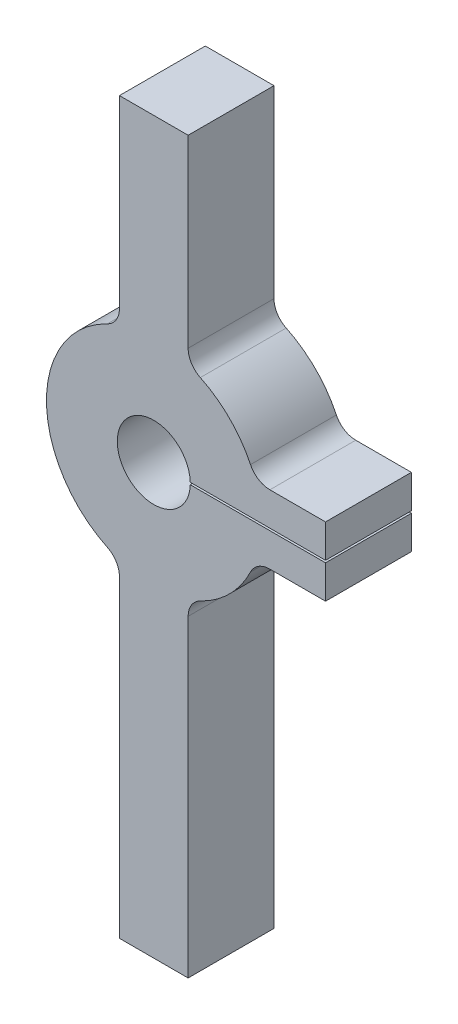
ISO-10303-21;
HEADER;
FILE_DESCRIPTION(('STEP AP214'),'2;1');
FILE_NAME('part.step','',(''),(''),'','','');
FILE_SCHEMA(('AUTOMOTIVE_DESIGN { 1 0 10303 214 1 1 1 1 }'));
ENDSEC;
DATA;
#1=APPLICATION_CONTEXT('core data for automotive mechanical design processes');
#2=APPLICATION_PROTOCOL_DEFINITION('international standard','automotive_design',2000,#1);
#3=PRODUCT_CONTEXT('',#1,'mechanical');
#4=PRODUCT('Part','Part','',(#3));
#5=PRODUCT_RELATED_PRODUCT_CATEGORY('part','',(#4));
#6=PRODUCT_DEFINITION_FORMATION('','',#4);
#7=PRODUCT_DEFINITION_CONTEXT('part definition',#1,'design');
#8=PRODUCT_DEFINITION('design','',#6,#7);
#9=PRODUCT_DEFINITION_SHAPE('','',#8);
#10=(LENGTH_UNIT() NAMED_UNIT(*) SI_UNIT(.MILLI.,.METRE.));
#11=(NAMED_UNIT(*) PLANE_ANGLE_UNIT() SI_UNIT($,.RADIAN.));
#12=(NAMED_UNIT(*) SI_UNIT($,.STERADIAN.) SOLID_ANGLE_UNIT());
#13=UNCERTAINTY_MEASURE_WITH_UNIT(LENGTH_MEASURE(1.E-05),#10,'distance_accuracy_value','');
#14=(GEOMETRIC_REPRESENTATION_CONTEXT(3) GLOBAL_UNCERTAINTY_ASSIGNED_CONTEXT((#13)) GLOBAL_UNIT_ASSIGNED_CONTEXT((#10,
#11,#12)) REPRESENTATION_CONTEXT('',''));
#15=CARTESIAN_POINT('',(0.,0.,0.));
#16=DIRECTION('',(0.,0.,1.));
#17=DIRECTION('',(1.,0.,0.));
#18=AXIS2_PLACEMENT_3D('',#15,#16,#17);
#19=CARTESIAN_POINT('',(0.,0.,-10.));
#20=DIRECTION('',(0.,0.,1.));
#21=DIRECTION('',(1.,0.,0.));
#22=AXIS2_PLACEMENT_3D('',#19,#20,#21);
#23=PLANE('',#22);
#24=CARTESIAN_POINT('',(0.,0.,-10.));
#25=DIRECTION('',(0.,0.,1.));
#26=DIRECTION('',(1.,0.,0.));
#27=AXIS2_PLACEMENT_3D('',#24,#25,#26);
#28=CIRCLE('',#27,14.);
#29=CARTESIAN_POINT('',(13.9977676791694,0.25,-10.));
#30=VERTEX_POINT('',#29);
#31=CARTESIAN_POINT('',(13.9977676791694,-0.25,-10.));
#32=VERTEX_POINT('',#31);
#33=EDGE_CURVE('E47',#30,#32,#28,.T.);
#34=ORIENTED_EDGE('',*,*,#33,.T.);
#35=DIRECTION('',(1.,0.,0.));
#36=VECTOR('',#35,1.);
#37=CARTESIAN_POINT('',(2.,-0.25,-10.));
#38=LINE('',#37,#36);
#39=CARTESIAN_POINT('',(40.,-0.25,-10.));
#40=VERTEX_POINT('',#39);
#41=EDGE_CURVE('E205',#32,#40,#38,.T.);
#42=ORIENTED_EDGE('',*,*,#41,.T.);
#43=DIRECTION('',(0.,1.,0.));
#44=VECTOR('',#43,1.);
#45=CARTESIAN_POINT('',(40.,-8.,-10.));
#46=LINE('',#45,#44);
#47=CARTESIAN_POINT('',(40.,-8.,-10.));
#48=VERTEX_POINT('',#47);
#49=EDGE_CURVE('E238',#48,#40,#46,.T.);
#50=ORIENTED_EDGE('',*,*,#49,.F.);
#51=DIRECTION('',(1.,0.,0.));
#52=VECTOR('',#51,1.);
#53=CARTESIAN_POINT('',(40.,-8.,-10.));
#54=LINE('',#53,#52);
#55=CARTESIAN_POINT('',(27.0370116691916,-8.,-10.));
#56=VERTEX_POINT('',#55);
#57=EDGE_CURVE('E224',#56,#48,#54,.T.);
#58=ORIENTED_EDGE('',*,*,#57,.F.);
#59=CARTESIAN_POINT('',(27.0370116691916,-13.,-10.));
#60=DIRECTION('',(0.,0.,1.));
#61=DIRECTION('',(1.,0.,0.));
#62=AXIS2_PLACEMENT_3D('',#59,#60,#61);
#63=CIRCLE('',#62,5.);
#64=CARTESIAN_POINT('',(22.5308430576596,-10.8333333333333,-10.));
#65=VERTEX_POINT('',#64);
#66=EDGE_CURVE('E333',#56,#65,#63,.T.);
#67=ORIENTED_EDGE('',*,*,#66,.T.);
#68=CARTESIAN_POINT('',(0.,0.,-10.));
#69=DIRECTION('',(0.,0.,1.));
#70=DIRECTION('',(1.,0.,0.));
#71=AXIS2_PLACEMENT_3D('',#68,#69,#70);
#72=CIRCLE('',#71,25.);
#73=CARTESIAN_POINT('',(10.8333333333333,-22.5308430576596,-10.));
#74=VERTEX_POINT('',#73);
#75=EDGE_CURVE('E298',#74,#65,#72,.T.);
#76=ORIENTED_EDGE('',*,*,#75,.F.);
#77=CARTESIAN_POINT('',(13.,-27.0370116691916,-10.));
#78=DIRECTION('',(0.,0.,1.));
#79=DIRECTION('',(1.,0.,0.));
#80=AXIS2_PLACEMENT_3D('',#77,#78,#79);
#81=CIRCLE('',#80,5.);
#82=CARTESIAN_POINT('',(8.00000000000001,-27.0370116691915,-10.));
#83=VERTEX_POINT('',#82);
#84=EDGE_CURVE('E345',#74,#83,#81,.T.);
#85=ORIENTED_EDGE('',*,*,#84,.T.);
#86=DIRECTION('',(0.,1.,0.));
#87=VECTOR('',#86,1.);
#88=CARTESIAN_POINT('',(8.00000000000001,-100.,-10.));
#89=LINE('',#88,#87);
#90=CARTESIAN_POINT('',(8.00000000000001,-100.,-10.));
#91=VERTEX_POINT('',#90);
#92=EDGE_CURVE('E247',#91,#83,#89,.T.);
#93=ORIENTED_EDGE('',*,*,#92,.F.);
#94=DIRECTION('',(1.,0.,0.));
#95=VECTOR('',#94,1.);
#96=CARTESIAN_POINT('',(-7.99999999999999,-100.,-10.));
#97=LINE('',#96,#95);
#98=CARTESIAN_POINT('',(-7.99999999999999,-100.,-10.));
#99=VERTEX_POINT('',#98);
#100=EDGE_CURVE('E252',#99,#91,#97,.T.);
#101=ORIENTED_EDGE('',*,*,#100,.F.);
#102=DIRECTION('',(0.,-1.,0.));
#103=VECTOR('',#102,1.);
#104=CARTESIAN_POINT('',(-7.99999999999999,-100.,-10.));
#105=LINE('',#104,#103);
#106=CARTESIAN_POINT('',(-8.,-27.0370116691916,-10.));
#107=VERTEX_POINT('',#106);
#108=EDGE_CURVE('E259',#107,#99,#105,.T.);
#109=ORIENTED_EDGE('',*,*,#108,.F.);
#110=CARTESIAN_POINT('',(-13.,-27.0370116691916,-10.));
#111=DIRECTION('',(0.,0.,1.));
#112=DIRECTION('',(1.,0.,0.));
#113=AXIS2_PLACEMENT_3D('',#110,#111,#112);
#114=CIRCLE('',#113,5.);
#115=CARTESIAN_POINT('',(-10.8333333333333,-22.5308430576596,-10.));
#116=VERTEX_POINT('',#115);
#117=EDGE_CURVE('E337',#107,#116,#114,.T.);
#118=ORIENTED_EDGE('',*,*,#117,.T.);
#119=CARTESIAN_POINT('',(-10.8333333333333,22.5308430576596,-10.));
#120=VERTEX_POINT('',#119);
#121=EDGE_CURVE('E294',#120,#116,#72,.T.);
#122=ORIENTED_EDGE('',*,*,#121,.F.);
#123=CARTESIAN_POINT('',(-13.,27.0370116691916,-10.));
#124=DIRECTION('',(0.,0.,1.));
#125=DIRECTION('',(1.,0.,0.));
#126=AXIS2_PLACEMENT_3D('',#123,#124,#125);
#127=CIRCLE('',#126,5.);
#128=CARTESIAN_POINT('',(-7.99999999999999,27.0370116691916,-10.));
#129=VERTEX_POINT('',#128);
#130=EDGE_CURVE('E341',#120,#129,#127,.T.);
#131=ORIENTED_EDGE('',*,*,#130,.T.);
#132=DIRECTION('',(0.,-1.,0.));
#133=VECTOR('',#132,1.);
#134=CARTESIAN_POINT('',(-8.,70.,-10.));
#135=LINE('',#134,#133);
#136=CARTESIAN_POINT('',(-8.,70.,-10.));
#137=VERTEX_POINT('',#136);
#138=EDGE_CURVE('E271',#137,#129,#135,.T.);
#139=ORIENTED_EDGE('',*,*,#138,.F.);
#140=DIRECTION('',(-1.,0.,0.));
#141=VECTOR('',#140,1.);
#142=CARTESIAN_POINT('',(-8.,70.,-10.));
#143=LINE('',#142,#141);
#144=CARTESIAN_POINT('',(8.,70.,-10.));
#145=VERTEX_POINT('',#144);
#146=EDGE_CURVE('E278',#145,#137,#143,.T.);
#147=ORIENTED_EDGE('',*,*,#146,.F.);
#148=DIRECTION('',(0.,1.,0.));
#149=VECTOR('',#148,1.);
#150=CARTESIAN_POINT('',(8.,70.,-10.));
#151=LINE('',#150,#149);
#152=CARTESIAN_POINT('',(7.99999999999999,27.0370116691916,-10.));
#153=VERTEX_POINT('',#152);
#154=EDGE_CURVE('E267',#153,#145,#151,.T.);
#155=ORIENTED_EDGE('',*,*,#154,.F.);
#156=CARTESIAN_POINT('',(13.,27.0370116691916,-10.));
#157=DIRECTION('',(0.,0.,1.));
#158=DIRECTION('',(1.,0.,0.));
#159=AXIS2_PLACEMENT_3D('',#156,#157,#158);
#160=CIRCLE('',#159,5.);
#161=CARTESIAN_POINT('',(10.8333333333333,22.5308430576596,-10.));
#162=VERTEX_POINT('',#161);
#163=EDGE_CURVE('E353',#153,#162,#160,.T.);
#164=ORIENTED_EDGE('',*,*,#163,.T.);
#165=CARTESIAN_POINT('',(22.5308430576596,10.8333333333333,-10.));
#166=VERTEX_POINT('',#165);
#167=EDGE_CURVE('E290',#166,#162,#72,.T.);
#168=ORIENTED_EDGE('',*,*,#167,.F.);
#169=CARTESIAN_POINT('',(27.0370116691916,13.,-10.));
#170=DIRECTION('',(0.,0.,1.));
#171=DIRECTION('',(1.,0.,0.));
#172=AXIS2_PLACEMENT_3D('',#169,#170,#171);
#173=CIRCLE('',#172,5.);
#174=CARTESIAN_POINT('',(27.0370116691916,8.,-10.));
#175=VERTEX_POINT('',#174);
#176=EDGE_CURVE('E349',#166,#175,#173,.T.);
#177=ORIENTED_EDGE('',*,*,#176,.T.);
#178=DIRECTION('',(-1.,0.,0.));
#179=VECTOR('',#178,1.);
#180=CARTESIAN_POINT('',(40.,8.,-10.));
#181=LINE('',#180,#179);
#182=CARTESIAN_POINT('',(40.,8.,-10.));
#183=VERTEX_POINT('',#182);
#184=EDGE_CURVE('E228',#183,#175,#181,.T.);
#185=ORIENTED_EDGE('',*,*,#184,.F.);
#186=CARTESIAN_POINT('',(40.,0.25,-10.));
#187=VERTEX_POINT('',#186);
#188=EDGE_CURVE('E237',#187,#183,#46,.T.);
#189=ORIENTED_EDGE('',*,*,#188,.F.);
#190=DIRECTION('',(-1.,0.,0.));
#191=VECTOR('',#190,1.);
#192=CARTESIAN_POINT('',(2.,0.25,-10.));
#193=LINE('',#192,#191);
#194=EDGE_CURVE('E208',#187,#30,#193,.T.);
#195=ORIENTED_EDGE('',*,*,#194,.T.);
#196=EDGE_LOOP('',(#34,#42,#50,#58,#67,#76,#85,#93,#101,#109,#118,#122,#131,#139,#147,#155,#164,
#168,#177,#185,#189,#195));
#197=FACE_BOUND('',#196,.T.);
#198=ADVANCED_FACE('F32',(#197),#23,.F.);
#199=CARTESIAN_POINT('',(0.,0.,10.));
#200=DIRECTION('',(0.,0.,-1.));
#201=DIRECTION('',(-1.,0.,0.));
#202=AXIS2_PLACEMENT_3D('',#199,#200,#201);
#203=CYLINDRICAL_SURFACE('',#202,8.5);
#204=DIRECTION('',(0.,0.,-1.));
#205=VECTOR('',#204,1.);
#206=CARTESIAN_POINT('',(8.49632273398321,-0.25,10.));
#207=LINE('',#206,#205);
#208=CARTESIAN_POINT('',(8.49632273398321,-0.25,-7.));
#209=VERTEX_POINT('',#208);
#210=CARTESIAN_POINT('',(8.49632273398321,-0.25,10.));
#211=VERTEX_POINT('',#210);
#212=EDGE_CURVE('E214',#209,#211,#207,.F.);
#213=ORIENTED_EDGE('',*,*,#212,.F.);
#214=CARTESIAN_POINT('',(0.,0.,-7.));
#215=DIRECTION('',(0.,0.,1.));
#216=DIRECTION('',(1.,0.,0.));
#217=AXIS2_PLACEMENT_3D('',#214,#215,#216);
#218=CIRCLE('',#217,8.5);
#219=CARTESIAN_POINT('',(8.49632273398321,0.25,-7.));
#220=VERTEX_POINT('',#219);
#221=EDGE_CURVE('E200',#220,#209,#218,.T.);
#222=ORIENTED_EDGE('',*,*,#221,.F.);
#223=DIRECTION('',(0.,0.,-1.));
#224=VECTOR('',#223,1.);
#225=CARTESIAN_POINT('',(8.49632273398321,0.25,10.));
#226=LINE('',#225,#224);
#227=CARTESIAN_POINT('',(8.49632273398321,0.25,10.));
#228=VERTEX_POINT('',#227);
#229=EDGE_CURVE('E216',#228,#220,#226,.T.);
#230=ORIENTED_EDGE('',*,*,#229,.F.);
#231=CARTESIAN_POINT('',(0.,0.,10.));
#232=DIRECTION('',(0.,0.,1.));
#233=DIRECTION('',(1.,0.,0.));
#234=AXIS2_PLACEMENT_3D('',#231,#232,#233);
#235=CIRCLE('',#234,8.5);
#236=EDGE_CURVE('E287',#228,#211,#235,.T.);
#237=ORIENTED_EDGE('',*,*,#236,.T.);
#238=EDGE_LOOP('',(#213,#222,#230,#237));
#239=FACE_BOUND('',#238,.T.);
#240=ADVANCED_FACE('F368',(#239),#203,.F.);
#241=CARTESIAN_POINT('',(2.,-0.25,-10.));
#242=DIRECTION('',(0.,-1.,0.));
#243=DIRECTION('',(0.,0.,-1.));
#244=AXIS2_PLACEMENT_3D('',#241,#242,#243);
#245=PLANE('',#244);
#246=DIRECTION('',(1.,0.,0.));
#247=VECTOR('',#246,1.);
#248=CARTESIAN_POINT('',(2.,-0.25,-7.));
#249=LINE('',#248,#247);
#250=CARTESIAN_POINT('',(13.9977676791694,-0.25,-7.));
#251=VERTEX_POINT('',#250);
#252=EDGE_CURVE('E199',#209,#251,#249,.T.);
#253=ORIENTED_EDGE('',*,*,#252,.F.);
#254=ORIENTED_EDGE('',*,*,#212,.T.);
#255=DIRECTION('',(1.,0.,0.));
#256=VECTOR('',#255,1.);
#257=CARTESIAN_POINT('',(2.,-0.25,10.));
#258=LINE('',#257,#256);
#259=CARTESIAN_POINT('',(40.,-0.25,10.));
#260=VERTEX_POINT('',#259);
#261=EDGE_CURVE('E218',#211,#260,#258,.T.);
#262=ORIENTED_EDGE('',*,*,#261,.T.);
#263=DIRECTION('',(0.,0.,1.));
#264=VECTOR('',#263,1.);
#265=CARTESIAN_POINT('',(40.,-0.25,10.));
#266=LINE('',#265,#264);
#267=EDGE_CURVE('E212',#40,#260,#266,.T.);
#268=ORIENTED_EDGE('',*,*,#267,.F.);
#269=ORIENTED_EDGE('',*,*,#41,.F.);
#270=DIRECTION('',(0.,0.,1.));
#271=VECTOR('',#270,1.);
#272=CARTESIAN_POINT('',(13.9977676791694,-0.25,0.));
#273=LINE('',#272,#271);
#274=EDGE_CURVE('E192',#251,#32,#273,.F.);
#275=ORIENTED_EDGE('',*,*,#274,.F.);
#276=EDGE_LOOP('',(#253,#254,#262,#268,#269,#275));
#277=FACE_BOUND('',#276,.T.);
#278=ADVANCED_FACE('F210',(#277),#245,.F.);
#279=CARTESIAN_POINT('',(2.,0.25,-10.));
#280=DIRECTION('',(0.,1.,0.));
#281=DIRECTION('',(0.,0.,1.));
#282=AXIS2_PLACEMENT_3D('',#279,#280,#281);
#283=PLANE('',#282);
#284=DIRECTION('',(-1.,0.,0.));
#285=VECTOR('',#284,1.);
#286=CARTESIAN_POINT('',(2.,0.25,-7.));
#287=LINE('',#286,#285);
#288=CARTESIAN_POINT('',(13.9977676791694,0.25,-7.));
#289=VERTEX_POINT('',#288);
#290=EDGE_CURVE('E11',#289,#220,#287,.T.);
#291=ORIENTED_EDGE('',*,*,#290,.F.);
#292=DIRECTION('',(0.,0.,1.));
#293=VECTOR('',#292,1.);
#294=CARTESIAN_POINT('',(13.9977676791694,0.25,0.));
#295=LINE('',#294,#293);
#296=EDGE_CURVE('E40',#30,#289,#295,.T.);
#297=ORIENTED_EDGE('',*,*,#296,.F.);
#298=ORIENTED_EDGE('',*,*,#194,.F.);
#299=DIRECTION('',(0.,0.,-1.));
#300=VECTOR('',#299,1.);
#301=CARTESIAN_POINT('',(40.,0.25,10.));
#302=LINE('',#301,#300);
#303=CARTESIAN_POINT('',(40.,0.25,10.));
#304=VERTEX_POINT('',#303);
#305=EDGE_CURVE('E300',#304,#187,#302,.T.);
#306=ORIENTED_EDGE('',*,*,#305,.F.);
#307=DIRECTION('',(-1.,0.,0.));
#308=VECTOR('',#307,1.);
#309=CARTESIAN_POINT('',(2.,0.25,10.));
#310=LINE('',#309,#308);
#311=EDGE_CURVE('E364',#304,#228,#310,.T.);
#312=ORIENTED_EDGE('',*,*,#311,.T.);
#313=ORIENTED_EDGE('',*,*,#229,.T.);
#314=EDGE_LOOP('',(#291,#297,#298,#306,#312,#313));
#315=FACE_BOUND('',#314,.T.);
#316=ADVANCED_FACE('F361',(#315),#283,.F.);
#317=CARTESIAN_POINT('',(40.,-8.,10.));
#318=DIRECTION('',(-1.,0.,0.));
#319=DIRECTION('',(0.,0.,1.));
#320=AXIS2_PLACEMENT_3D('',#317,#318,#319);
#321=PLANE('',#320);
#322=DIRECTION('',(0.,1.,0.));
#323=VECTOR('',#322,1.);
#324=CARTESIAN_POINT('',(40.,-8.,10.));
#325=LINE('',#324,#323);
#326=CARTESIAN_POINT('',(40.,8.,10.));
#327=VERTEX_POINT('',#326);
#328=EDGE_CURVE('E227',#304,#327,#325,.T.);
#329=ORIENTED_EDGE('',*,*,#328,.F.);
#330=ORIENTED_EDGE('',*,*,#305,.T.);
#331=ORIENTED_EDGE('',*,*,#188,.T.);
#332=DIRECTION('',(0.,0.,-1.));
#333=VECTOR('',#332,1.);
#334=CARTESIAN_POINT('',(40.,8.,10.));
#335=LINE('',#334,#333);
#336=EDGE_CURVE('E235',#327,#183,#335,.T.);
#337=ORIENTED_EDGE('',*,*,#336,.F.);
#338=EDGE_LOOP('',(#329,#330,#331,#337));
#339=FACE_BOUND('',#338,.T.);
#340=ADVANCED_FACE('F455',(#339),#321,.F.);
#341=CARTESIAN_POINT('',(0.,0.,10.));
#342=DIRECTION('',(0.,0.,-1.));
#343=DIRECTION('',(-1.,0.,0.));
#344=AXIS2_PLACEMENT_3D('',#341,#342,#343);
#345=CYLINDRICAL_SURFACE('',#344,25.);
#346=ORIENTED_EDGE('',*,*,#75,.T.);
#347=DIRECTION('',(0.,0.,-1.));
#348=VECTOR('',#347,1.);
#349=CARTESIAN_POINT('',(22.5308430576596,-10.8333333333333,10.));
#350=LINE('',#349,#348);
#351=CARTESIAN_POINT('',(22.5308430576596,-10.8333333333333,10.));
#352=VERTEX_POINT('',#351);
#353=EDGE_CURVE('E309',#65,#352,#350,.F.);
#354=ORIENTED_EDGE('',*,*,#353,.T.);
#355=CARTESIAN_POINT('',(0.,0.,10.));
#356=DIRECTION('',(0.,0.,1.));
#357=DIRECTION('',(1.,0.,0.));
#358=AXIS2_PLACEMENT_3D('',#355,#356,#357);
#359=CIRCLE('',#358,25.);
#360=CARTESIAN_POINT('',(10.8333333333333,-22.5308430576596,10.));
#361=VERTEX_POINT('',#360);
#362=EDGE_CURVE('E293',#361,#352,#359,.T.);
#363=ORIENTED_EDGE('',*,*,#362,.F.);
#364=DIRECTION('',(0.,0.,-1.));
#365=VECTOR('',#364,1.);
#366=CARTESIAN_POINT('',(10.8333333333333,-22.5308430576596,10.));
#367=LINE('',#366,#365);
#368=EDGE_CURVE('E306',#361,#74,#367,.T.);
#369=ORIENTED_EDGE('',*,*,#368,.T.);
#370=EDGE_LOOP('',(#346,#354,#363,#369));
#371=FACE_BOUND('',#370,.T.);
#372=ADVANCED_FACE('F393',(#371),#345,.T.);
#373=CARTESIAN_POINT('',(22.5308430576596,10.8333333333333,10.));
#374=VERTEX_POINT('',#373);
#375=CARTESIAN_POINT('',(10.8333333333333,22.5308430576596,10.));
#376=VERTEX_POINT('',#375);
#377=EDGE_CURVE('E291',#374,#376,#359,.T.);
#378=ORIENTED_EDGE('',*,*,#377,.F.);
#379=DIRECTION('',(0.,0.,-1.));
#380=VECTOR('',#379,1.);
#381=CARTESIAN_POINT('',(22.5308430576596,10.8333333333333,10.));
#382=LINE('',#381,#380);
#383=EDGE_CURVE('E325',#374,#166,#382,.T.);
#384=ORIENTED_EDGE('',*,*,#383,.T.);
#385=ORIENTED_EDGE('',*,*,#167,.T.);
#386=DIRECTION('',(0.,0.,-1.));
#387=VECTOR('',#386,1.);
#388=CARTESIAN_POINT('',(10.8333333333333,22.5308430576596,10.));
#389=LINE('',#388,#387);
#390=EDGE_CURVE('E323',#162,#376,#389,.F.);
#391=ORIENTED_EDGE('',*,*,#390,.T.);
#392=EDGE_LOOP('',(#378,#384,#385,#391));
#393=FACE_BOUND('',#392,.T.);
#394=ADVANCED_FACE('F454',(#393),#345,.T.);
#395=ORIENTED_EDGE('',*,*,#121,.T.);
#396=DIRECTION('',(0.,0.,-1.));
#397=VECTOR('',#396,1.);
#398=CARTESIAN_POINT('',(-10.8333333333333,-22.5308430576596,10.));
#399=LINE('',#398,#397);
#400=CARTESIAN_POINT('',(-10.8333333333333,-22.5308430576596,10.));
#401=VERTEX_POINT('',#400);
#402=EDGE_CURVE('E317',#116,#401,#399,.F.);
#403=ORIENTED_EDGE('',*,*,#402,.T.);
#404=CARTESIAN_POINT('',(-10.8333333333333,22.5308430576596,10.));
#405=VERTEX_POINT('',#404);
#406=EDGE_CURVE('E295',#405,#401,#359,.T.);
#407=ORIENTED_EDGE('',*,*,#406,.F.);
#408=DIRECTION('',(0.,0.,-1.));
#409=VECTOR('',#408,1.);
#410=CARTESIAN_POINT('',(-10.8333333333333,22.5308430576596,10.));
#411=LINE('',#410,#409);
#412=EDGE_CURVE('E314',#405,#120,#411,.T.);
#413=ORIENTED_EDGE('',*,*,#412,.T.);
#414=EDGE_LOOP('',(#395,#403,#407,#413));
#415=FACE_BOUND('',#414,.T.);
#416=ADVANCED_FACE('F425',(#415),#345,.T.);
#417=CARTESIAN_POINT('',(0.,0.,10.));
#418=DIRECTION('',(0.,0.,1.));
#419=DIRECTION('',(1.,0.,0.));
#420=AXIS2_PLACEMENT_3D('',#417,#418,#419);
#421=PLANE('',#420);
#422=ORIENTED_EDGE('',*,*,#311,.F.);
#423=ORIENTED_EDGE('',*,*,#328,.T.);
#424=DIRECTION('',(-1.,0.,0.));
#425=VECTOR('',#424,1.);
#426=CARTESIAN_POINT('',(40.,8.,10.));
#427=LINE('',#426,#425);
#428=CARTESIAN_POINT('',(27.0370116691916,8.,10.));
#429=VERTEX_POINT('',#428);
#430=EDGE_CURVE('E232',#327,#429,#427,.T.);
#431=ORIENTED_EDGE('',*,*,#430,.T.);
#432=CARTESIAN_POINT('',(27.0370116691916,13.,10.));
#433=DIRECTION('',(0.,0.,1.));
#434=DIRECTION('',(1.,0.,0.));
#435=AXIS2_PLACEMENT_3D('',#432,#433,#434);
#436=CIRCLE('',#435,5.);
#437=EDGE_CURVE('E351',#429,#374,#436,.F.);
#438=ORIENTED_EDGE('',*,*,#437,.T.);
#439=ORIENTED_EDGE('',*,*,#377,.T.);
#440=CARTESIAN_POINT('',(13.,27.0370116691916,10.));
#441=DIRECTION('',(0.,0.,1.));
#442=DIRECTION('',(1.,0.,0.));
#443=AXIS2_PLACEMENT_3D('',#440,#441,#442);
#444=CIRCLE('',#443,5.);
#445=CARTESIAN_POINT('',(7.99999999999999,27.0370116691916,10.));
#446=VERTEX_POINT('',#445);
#447=EDGE_CURVE('E55',#376,#446,#444,.F.);
#448=ORIENTED_EDGE('',*,*,#447,.T.);
#449=DIRECTION('',(0.,1.,0.));
#450=VECTOR('',#449,1.);
#451=CARTESIAN_POINT('',(8.,70.,10.));
#452=LINE('',#451,#450);
#453=CARTESIAN_POINT('',(8.,70.,10.));
#454=VERTEX_POINT('',#453);
#455=EDGE_CURVE('E268',#446,#454,#452,.T.);
#456=ORIENTED_EDGE('',*,*,#455,.T.);
#457=DIRECTION('',(-1.,0.,0.));
#458=VECTOR('',#457,1.);
#459=CARTESIAN_POINT('',(-8.,70.,10.));
#460=LINE('',#459,#458);
#461=CARTESIAN_POINT('',(-8.,70.,10.));
#462=VERTEX_POINT('',#461);
#463=EDGE_CURVE('E270',#454,#462,#460,.T.);
#464=ORIENTED_EDGE('',*,*,#463,.T.);
#465=DIRECTION('',(0.,-1.,0.));
#466=VECTOR('',#465,1.);
#467=CARTESIAN_POINT('',(-8.,70.,10.));
#468=LINE('',#467,#466);
#469=CARTESIAN_POINT('',(-7.99999999999999,27.0370116691916,10.));
#470=VERTEX_POINT('',#469);
#471=EDGE_CURVE('E273',#462,#470,#468,.T.);
#472=ORIENTED_EDGE('',*,*,#471,.T.);
#473=CARTESIAN_POINT('',(-13.,27.0370116691916,10.));
#474=DIRECTION('',(0.,0.,1.));
#475=DIRECTION('',(1.,0.,0.));
#476=AXIS2_PLACEMENT_3D('',#473,#474,#475);
#477=CIRCLE('',#476,5.);
#478=EDGE_CURVE('E343',#470,#405,#477,.F.);
#479=ORIENTED_EDGE('',*,*,#478,.T.);
#480=ORIENTED_EDGE('',*,*,#406,.T.);
#481=CARTESIAN_POINT('',(-13.,-27.0370116691916,10.));
#482=DIRECTION('',(0.,0.,1.));
#483=DIRECTION('',(1.,0.,0.));
#484=AXIS2_PLACEMENT_3D('',#481,#482,#483);
#485=CIRCLE('',#484,5.);
#486=CARTESIAN_POINT('',(-8.,-27.0370116691916,10.));
#487=VERTEX_POINT('',#486);
#488=EDGE_CURVE('E339',#401,#487,#485,.F.);
#489=ORIENTED_EDGE('',*,*,#488,.T.);
#490=DIRECTION('',(0.,-1.,0.));
#491=VECTOR('',#490,1.);
#492=CARTESIAN_POINT('',(-7.99999999999999,-100.,10.));
#493=LINE('',#492,#491);
#494=CARTESIAN_POINT('',(-7.99999999999999,-100.,10.));
#495=VERTEX_POINT('',#494);
#496=EDGE_CURVE('E251',#487,#495,#493,.T.);
#497=ORIENTED_EDGE('',*,*,#496,.T.);
#498=DIRECTION('',(1.,0.,0.));
#499=VECTOR('',#498,1.);
#500=CARTESIAN_POINT('',(-7.99999999999999,-100.,10.));
#501=LINE('',#500,#499);
#502=CARTESIAN_POINT('',(8.00000000000001,-100.,10.));
#503=VERTEX_POINT('',#502);
#504=EDGE_CURVE('E254',#495,#503,#501,.T.);
#505=ORIENTED_EDGE('',*,*,#504,.T.);
#506=DIRECTION('',(0.,1.,0.));
#507=VECTOR('',#506,1.);
#508=CARTESIAN_POINT('',(8.00000000000001,-100.,10.));
#509=LINE('',#508,#507);
#510=CARTESIAN_POINT('',(8.00000000000001,-27.0370116691915,10.));
#511=VERTEX_POINT('',#510);
#512=EDGE_CURVE('E248',#503,#511,#509,.T.);
#513=ORIENTED_EDGE('',*,*,#512,.T.);
#514=CARTESIAN_POINT('',(13.,-27.0370116691916,10.));
#515=DIRECTION('',(0.,0.,1.));
#516=DIRECTION('',(1.,0.,0.));
#517=AXIS2_PLACEMENT_3D('',#514,#515,#516);
#518=CIRCLE('',#517,5.);
#519=EDGE_CURVE('E347',#511,#361,#518,.F.);
#520=ORIENTED_EDGE('',*,*,#519,.T.);
#521=ORIENTED_EDGE('',*,*,#362,.T.);
#522=CARTESIAN_POINT('',(27.0370116691916,-13.,10.));
#523=DIRECTION('',(0.,0.,1.));
#524=DIRECTION('',(1.,0.,0.));
#525=AXIS2_PLACEMENT_3D('',#522,#523,#524);
#526=CIRCLE('',#525,5.);
#527=CARTESIAN_POINT('',(27.0370116691916,-8.,10.));
#528=VERTEX_POINT('',#527);
#529=EDGE_CURVE('E335',#352,#528,#526,.F.);
#530=ORIENTED_EDGE('',*,*,#529,.T.);
#531=DIRECTION('',(1.,0.,0.));
#532=VECTOR('',#531,1.);
#533=CARTESIAN_POINT('',(40.,-8.,10.));
#534=LINE('',#533,#532);
#535=CARTESIAN_POINT('',(40.,-8.,10.));
#536=VERTEX_POINT('',#535);
#537=EDGE_CURVE('E225',#528,#536,#534,.T.);
#538=ORIENTED_EDGE('',*,*,#537,.T.);
#539=EDGE_CURVE('E229',#536,#260,#325,.T.);
#540=ORIENTED_EDGE('',*,*,#539,.T.);
#541=ORIENTED_EDGE('',*,*,#261,.F.);
#542=ORIENTED_EDGE('',*,*,#236,.F.);
#543=EDGE_LOOP('',(#422,#423,#431,#438,#439,#448,#456,#464,#472,#479,#480,#489,#497,#505,#513,
#520,#521,#530,#538,#540,#541,#542));
#544=FACE_BOUND('',#543,.T.);
#545=ADVANCED_FACE('F370',(#544),#421,.T.);
#546=CARTESIAN_POINT('',(8.,70.,10.));
#547=DIRECTION('',(-1.,0.,0.));
#548=DIRECTION('',(0.,-1.,0.));
#549=AXIS2_PLACEMENT_3D('',#546,#547,#548);
#550=PLANE('',#549);
#551=ORIENTED_EDGE('',*,*,#455,.F.);
#552=DIRECTION('',(0.,0.,1.));
#553=VECTOR('',#552,1.);
#554=CARTESIAN_POINT('',(7.99999999999999,27.0370116691916,-10.));
#555=LINE('',#554,#553);
#556=EDGE_CURVE('E330',#446,#153,#555,.F.);
#557=ORIENTED_EDGE('',*,*,#556,.T.);
#558=ORIENTED_EDGE('',*,*,#154,.T.);
#559=DIRECTION('',(0.,0.,-1.));
#560=VECTOR('',#559,1.);
#561=CARTESIAN_POINT('',(8.,70.,10.));
#562=LINE('',#561,#560);
#563=EDGE_CURVE('E284',#454,#145,#562,.T.);
#564=ORIENTED_EDGE('',*,*,#563,.F.);
#565=EDGE_LOOP('',(#551,#557,#558,#564));
#566=FACE_BOUND('',#565,.T.);
#567=ADVANCED_FACE('F483',(#566),#550,.F.);
#568=CARTESIAN_POINT('',(-8.,70.,10.));
#569=DIRECTION('',(0.,-1.,0.));
#570=DIRECTION('',(0.,0.,-1.));
#571=AXIS2_PLACEMENT_3D('',#568,#569,#570);
#572=PLANE('',#571);
#573=ORIENTED_EDGE('',*,*,#146,.T.);
#574=DIRECTION('',(0.,0.,-1.));
#575=VECTOR('',#574,1.);
#576=CARTESIAN_POINT('',(-8.,70.,10.));
#577=LINE('',#576,#575);
#578=EDGE_CURVE('E276',#462,#137,#577,.T.);
#579=ORIENTED_EDGE('',*,*,#578,.F.);
#580=ORIENTED_EDGE('',*,*,#463,.F.);
#581=ORIENTED_EDGE('',*,*,#563,.T.);
#582=EDGE_LOOP('',(#573,#579,#580,#581));
#583=FACE_BOUND('',#582,.T.);
#584=ADVANCED_FACE('F480',(#583),#572,.F.);
#585=CARTESIAN_POINT('',(-8.,70.,10.));
#586=DIRECTION('',(1.,0.,0.));
#587=DIRECTION('',(0.,1.,0.));
#588=AXIS2_PLACEMENT_3D('',#585,#586,#587);
#589=PLANE('',#588);
#590=ORIENTED_EDGE('',*,*,#138,.T.);
#591=DIRECTION('',(0.,0.,1.));
#592=VECTOR('',#591,1.);
#593=CARTESIAN_POINT('',(-7.99999999999999,27.0370116691916,10.));
#594=LINE('',#593,#592);
#595=EDGE_CURVE('E319',#129,#470,#594,.T.);
#596=ORIENTED_EDGE('',*,*,#595,.T.);
#597=ORIENTED_EDGE('',*,*,#471,.F.);
#598=ORIENTED_EDGE('',*,*,#578,.T.);
#599=EDGE_LOOP('',(#590,#596,#597,#598));
#600=FACE_BOUND('',#599,.T.);
#601=ADVANCED_FACE('F431',(#600),#589,.F.);
#602=CARTESIAN_POINT('',(8.00000000000001,-100.,10.));
#603=DIRECTION('',(-1.,0.,0.));
#604=DIRECTION('',(0.,-1.,0.));
#605=AXIS2_PLACEMENT_3D('',#602,#603,#604);
#606=PLANE('',#605);
#607=ORIENTED_EDGE('',*,*,#92,.T.);
#608=DIRECTION('',(0.,0.,1.));
#609=VECTOR('',#608,1.);
#610=CARTESIAN_POINT('',(8.00000000000001,-27.0370116691916,10.));
#611=LINE('',#610,#609);
#612=EDGE_CURVE('E321',#83,#511,#611,.T.);
#613=ORIENTED_EDGE('',*,*,#612,.T.);
#614=ORIENTED_EDGE('',*,*,#512,.F.);
#615=DIRECTION('',(0.,0.,-1.));
#616=VECTOR('',#615,1.);
#617=CARTESIAN_POINT('',(8.00000000000001,-100.,10.));
#618=LINE('',#617,#616);
#619=EDGE_CURVE('E256',#503,#91,#618,.T.);
#620=ORIENTED_EDGE('',*,*,#619,.T.);
#621=EDGE_LOOP('',(#607,#613,#614,#620));
#622=FACE_BOUND('',#621,.T.);
#623=ADVANCED_FACE('F421',(#622),#606,.F.);
#624=CARTESIAN_POINT('',(-7.99999999999999,-100.,10.));
#625=DIRECTION('',(1.,0.,0.));
#626=DIRECTION('',(0.,1.,0.));
#627=AXIS2_PLACEMENT_3D('',#624,#625,#626);
#628=PLANE('',#627);
#629=ORIENTED_EDGE('',*,*,#496,.F.);
#630=DIRECTION('',(0.,0.,1.));
#631=VECTOR('',#630,1.);
#632=CARTESIAN_POINT('',(-8.,-27.0370116691916,-10.));
#633=LINE('',#632,#631);
#634=EDGE_CURVE('E311',#487,#107,#633,.F.);
#635=ORIENTED_EDGE('',*,*,#634,.T.);
#636=ORIENTED_EDGE('',*,*,#108,.T.);
#637=DIRECTION('',(0.,0.,-1.));
#638=VECTOR('',#637,1.);
#639=CARTESIAN_POINT('',(-7.99999999999999,-100.,10.));
#640=LINE('',#639,#638);
#641=EDGE_CURVE('E264',#495,#99,#640,.T.);
#642=ORIENTED_EDGE('',*,*,#641,.F.);
#643=EDGE_LOOP('',(#629,#635,#636,#642));
#644=FACE_BOUND('',#643,.T.);
#645=ADVANCED_FACE('F409',(#644),#628,.F.);
#646=CARTESIAN_POINT('',(-7.99999999999999,-100.,10.));
#647=DIRECTION('',(0.,1.,0.));
#648=DIRECTION('',(0.,0.,1.));
#649=AXIS2_PLACEMENT_3D('',#646,#647,#648);
#650=PLANE('',#649);
#651=ORIENTED_EDGE('',*,*,#100,.T.);
#652=ORIENTED_EDGE('',*,*,#619,.F.);
#653=ORIENTED_EDGE('',*,*,#504,.F.);
#654=ORIENTED_EDGE('',*,*,#641,.T.);
#655=EDGE_LOOP('',(#651,#652,#653,#654));
#656=FACE_BOUND('',#655,.T.);
#657=ADVANCED_FACE('F417',(#656),#650,.F.);
#658=CARTESIAN_POINT('',(40.,-8.,10.));
#659=DIRECTION('',(0.,1.,0.));
#660=DIRECTION('',(-1.,0.,0.));
#661=AXIS2_PLACEMENT_3D('',#658,#659,#660);
#662=PLANE('',#661);
#663=ORIENTED_EDGE('',*,*,#537,.F.);
#664=DIRECTION('',(0.,0.,1.));
#665=VECTOR('',#664,1.);
#666=CARTESIAN_POINT('',(27.0370116691916,-8.,-10.));
#667=LINE('',#666,#665);
#668=EDGE_CURVE('E303',#528,#56,#667,.F.);
#669=ORIENTED_EDGE('',*,*,#668,.T.);
#670=ORIENTED_EDGE('',*,*,#57,.T.);
#671=DIRECTION('',(0.,0.,-1.));
#672=VECTOR('',#671,1.);
#673=CARTESIAN_POINT('',(40.,-8.,10.));
#674=LINE('',#673,#672);
#675=EDGE_CURVE('E244',#536,#48,#674,.T.);
#676=ORIENTED_EDGE('',*,*,#675,.F.);
#677=EDGE_LOOP('',(#663,#669,#670,#676));
#678=FACE_BOUND('',#677,.T.);
#679=ADVANCED_FACE('F384',(#678),#662,.F.);
#680=ORIENTED_EDGE('',*,*,#49,.T.);
#681=ORIENTED_EDGE('',*,*,#267,.T.);
#682=ORIENTED_EDGE('',*,*,#539,.F.);
#683=ORIENTED_EDGE('',*,*,#675,.T.);
#684=EDGE_LOOP('',(#680,#681,#682,#683));
#685=FACE_BOUND('',#684,.T.);
#686=ADVANCED_FACE('F377',(#685),#321,.F.);
#687=CARTESIAN_POINT('',(40.,8.,10.));
#688=DIRECTION('',(0.,-1.,0.));
#689=DIRECTION('',(1.,0.,0.));
#690=AXIS2_PLACEMENT_3D('',#687,#688,#689);
#691=PLANE('',#690);
#692=ORIENTED_EDGE('',*,*,#184,.T.);
#693=DIRECTION('',(0.,0.,1.));
#694=VECTOR('',#693,1.);
#695=CARTESIAN_POINT('',(27.0370116691916,8.,10.));
#696=LINE('',#695,#694);
#697=EDGE_CURVE('E328',#175,#429,#696,.T.);
#698=ORIENTED_EDGE('',*,*,#697,.T.);
#699=ORIENTED_EDGE('',*,*,#430,.F.);
#700=ORIENTED_EDGE('',*,*,#336,.T.);
#701=EDGE_LOOP('',(#692,#698,#699,#700));
#702=FACE_BOUND('',#701,.T.);
#703=ADVANCED_FACE('F457',(#702),#691,.F.);
#704=CARTESIAN_POINT('',(27.0370116691916,-13.,10.));
#705=DIRECTION('',(0.,0.,-1.));
#706=DIRECTION('',(-1.,0.,0.));
#707=AXIS2_PLACEMENT_3D('',#704,#705,#706);
#708=CYLINDRICAL_SURFACE('',#707,5.);
#709=ORIENTED_EDGE('',*,*,#529,.F.);
#710=ORIENTED_EDGE('',*,*,#353,.F.);
#711=ORIENTED_EDGE('',*,*,#66,.F.);
#712=ORIENTED_EDGE('',*,*,#668,.F.);
#713=EDGE_LOOP('',(#709,#710,#711,#712));
#714=FACE_BOUND('',#713,.T.);
#715=ADVANCED_FACE('F388',(#714),#708,.F.);
#716=CARTESIAN_POINT('',(-13.,-27.0370116691916,10.));
#717=DIRECTION('',(0.,0.,-1.));
#718=DIRECTION('',(-1.,0.,0.));
#719=AXIS2_PLACEMENT_3D('',#716,#717,#718);
#720=CYLINDRICAL_SURFACE('',#719,5.);
#721=ORIENTED_EDGE('',*,*,#488,.F.);
#722=ORIENTED_EDGE('',*,*,#402,.F.);
#723=ORIENTED_EDGE('',*,*,#117,.F.);
#724=ORIENTED_EDGE('',*,*,#634,.F.);
#725=EDGE_LOOP('',(#721,#722,#723,#724));
#726=FACE_BOUND('',#725,.T.);
#727=ADVANCED_FACE('F406',(#726),#720,.F.);
#728=CARTESIAN_POINT('',(-13.,27.0370116691916,10.));
#729=DIRECTION('',(0.,0.,-1.));
#730=DIRECTION('',(-1.,0.,0.));
#731=AXIS2_PLACEMENT_3D('',#728,#729,#730);
#732=CYLINDRICAL_SURFACE('',#731,5.);
#733=ORIENTED_EDGE('',*,*,#478,.F.);
#734=ORIENTED_EDGE('',*,*,#595,.F.);
#735=ORIENTED_EDGE('',*,*,#130,.F.);
#736=ORIENTED_EDGE('',*,*,#412,.F.);
#737=EDGE_LOOP('',(#733,#734,#735,#736));
#738=FACE_BOUND('',#737,.T.);
#739=ADVANCED_FACE('F434',(#738),#732,.F.);
#740=CARTESIAN_POINT('',(13.,-27.0370116691916,10.));
#741=DIRECTION('',(0.,0.,-1.));
#742=DIRECTION('',(-1.,0.,0.));
#743=AXIS2_PLACEMENT_3D('',#740,#741,#742);
#744=CYLINDRICAL_SURFACE('',#743,5.);
#745=ORIENTED_EDGE('',*,*,#519,.F.);
#746=ORIENTED_EDGE('',*,*,#612,.F.);
#747=ORIENTED_EDGE('',*,*,#84,.F.);
#748=ORIENTED_EDGE('',*,*,#368,.F.);
#749=EDGE_LOOP('',(#745,#746,#747,#748));
#750=FACE_BOUND('',#749,.T.);
#751=ADVANCED_FACE('F424',(#750),#744,.F.);
#752=CARTESIAN_POINT('',(27.0370116691916,13.,10.));
#753=DIRECTION('',(0.,0.,-1.));
#754=DIRECTION('',(-1.,0.,0.));
#755=AXIS2_PLACEMENT_3D('',#752,#753,#754);
#756=CYLINDRICAL_SURFACE('',#755,5.);
#757=ORIENTED_EDGE('',*,*,#437,.F.);
#758=ORIENTED_EDGE('',*,*,#697,.F.);
#759=ORIENTED_EDGE('',*,*,#176,.F.);
#760=ORIENTED_EDGE('',*,*,#383,.F.);
#761=EDGE_LOOP('',(#757,#758,#759,#760));
#762=FACE_BOUND('',#761,.T.);
#763=ADVANCED_FACE('F441',(#762),#756,.F.);
#764=CARTESIAN_POINT('',(13.,27.0370116691916,10.));
#765=DIRECTION('',(0.,0.,-1.));
#766=DIRECTION('',(-1.,0.,0.));
#767=AXIS2_PLACEMENT_3D('',#764,#765,#766);
#768=CYLINDRICAL_SURFACE('',#767,5.);
#769=ORIENTED_EDGE('',*,*,#447,.F.);
#770=ORIENTED_EDGE('',*,*,#390,.F.);
#771=ORIENTED_EDGE('',*,*,#163,.F.);
#772=ORIENTED_EDGE('',*,*,#556,.F.);
#773=EDGE_LOOP('',(#769,#770,#771,#772));
#774=FACE_BOUND('',#773,.T.);
#775=ADVANCED_FACE('F34',(#774),#768,.F.);
#776=CARTESIAN_POINT('',(0.,8.5,-7.));
#777=DIRECTION('',(0.,0.,-1.));
#778=DIRECTION('',(-1.,0.,0.));
#779=AXIS2_PLACEMENT_3D('',#776,#777,#778);
#780=PLANE('',#779);
#781=ORIENTED_EDGE('',*,*,#252,.T.);
#782=CARTESIAN_POINT('',(0.,0.,-7.));
#783=DIRECTION('',(0.,0.,1.));
#784=DIRECTION('',(1.,0.,0.));
#785=AXIS2_PLACEMENT_3D('',#782,#783,#784);
#786=CIRCLE('',#785,14.);
#787=EDGE_CURVE('E195',#289,#251,#786,.T.);
#788=ORIENTED_EDGE('',*,*,#787,.F.);
#789=ORIENTED_EDGE('',*,*,#290,.T.);
#790=ORIENTED_EDGE('',*,*,#221,.T.);
#791=EDGE_LOOP('',(#781,#788,#789,#790));
#792=FACE_BOUND('',#791,.T.);
#793=ADVANCED_FACE('F358',(#792),#780,.T.);
#794=CARTESIAN_POINT('',(0.,0.,0.));
#795=DIRECTION('',(0.,0.,1.));
#796=DIRECTION('',(1.,0.,0.));
#797=AXIS2_PLACEMENT_3D('',#794,#795,#796);
#798=CYLINDRICAL_SURFACE('',#797,14.);
#799=ORIENTED_EDGE('',*,*,#274,.T.);
#800=ORIENTED_EDGE('',*,*,#33,.F.);
#801=ORIENTED_EDGE('',*,*,#296,.T.);
#802=ORIENTED_EDGE('',*,*,#787,.T.);
#803=EDGE_LOOP('',(#799,#800,#801,#802));
#804=FACE_BOUND('',#803,.T.);
#805=ADVANCED_FACE('F193',(#804),#798,.F.);
#806=CLOSED_SHELL('',(#198,#240,#278,#316,#340,#372,#394,#416,#545,#567,#584,#601,#623,#645,
#657,#679,#686,#703,#715,#727,#739,#751,#763,#775,#793,#805));
#807=MANIFOLD_SOLID_BREP('B2',#806);
#808=ADVANCED_BREP_SHAPE_REPRESENTATION('',(#18,#807),#14);
#809=SHAPE_DEFINITION_REPRESENTATION(#9,#808);
ENDSEC;
END-ISO-10303-21;
